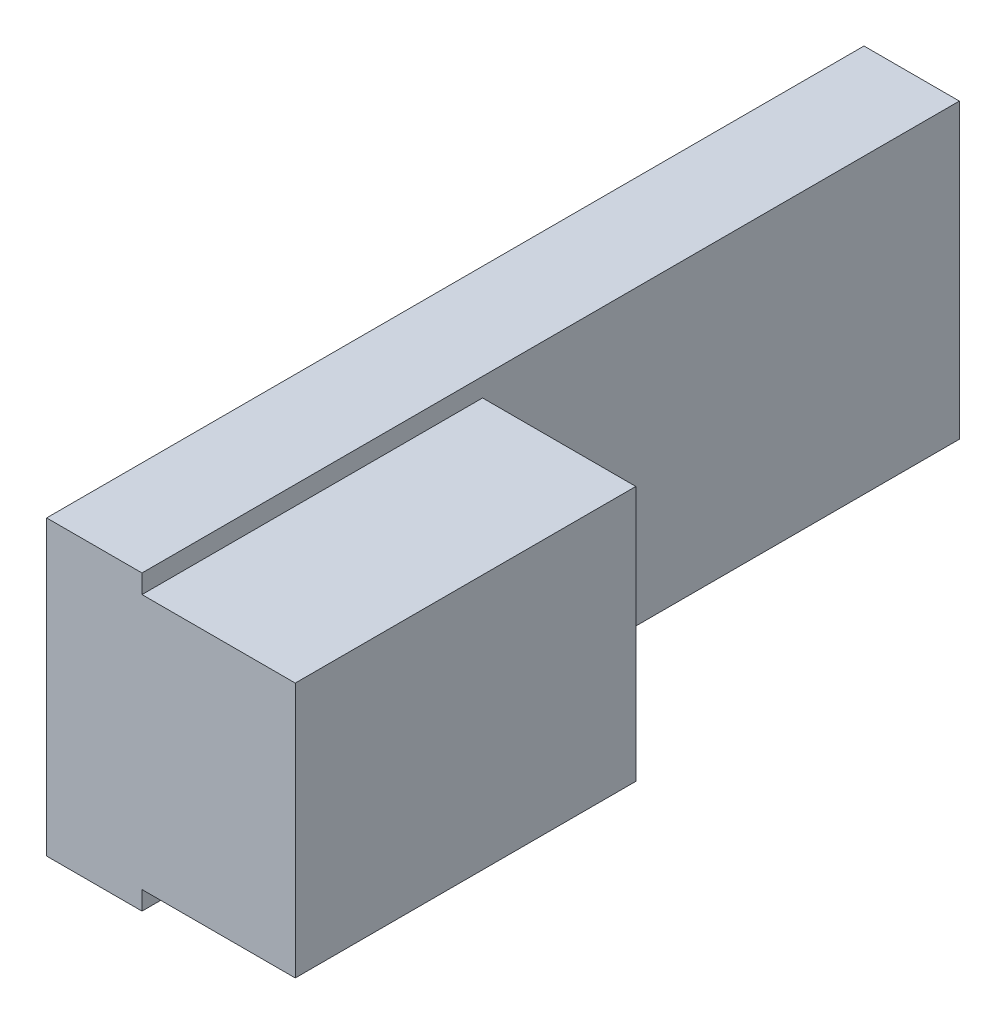
ISO-10303-21;
HEADER;
FILE_DESCRIPTION(('STEP AP214'),'2;1');
FILE_NAME('part.step','',(''),(''),'','','');
FILE_SCHEMA(('AUTOMOTIVE_DESIGN { 1 0 10303 214 1 1 1 1 }'));
ENDSEC;
DATA;
#1=APPLICATION_CONTEXT('core data for automotive mechanical design processes');
#2=APPLICATION_PROTOCOL_DEFINITION('international standard','automotive_design',2000,#1);
#3=PRODUCT_CONTEXT('',#1,'mechanical');
#4=PRODUCT('Part','Part','',(#3));
#5=PRODUCT_RELATED_PRODUCT_CATEGORY('part','',(#4));
#6=PRODUCT_DEFINITION_FORMATION('','',#4);
#7=PRODUCT_DEFINITION_CONTEXT('part definition',#1,'design');
#8=PRODUCT_DEFINITION('design','',#6,#7);
#9=PRODUCT_DEFINITION_SHAPE('','',#8);
#10=(LENGTH_UNIT() NAMED_UNIT(*) SI_UNIT(.MILLI.,.METRE.));
#11=(NAMED_UNIT(*) PLANE_ANGLE_UNIT() SI_UNIT($,.RADIAN.));
#12=(NAMED_UNIT(*) SI_UNIT($,.STERADIAN.) SOLID_ANGLE_UNIT());
#13=UNCERTAINTY_MEASURE_WITH_UNIT(LENGTH_MEASURE(1.E-05),#10,'distance_accuracy_value','');
#14=(GEOMETRIC_REPRESENTATION_CONTEXT(3) GLOBAL_UNCERTAINTY_ASSIGNED_CONTEXT((#13)) GLOBAL_UNIT_ASSIGNED_CONTEXT((#10,
#11,#12)) REPRESENTATION_CONTEXT('',''));
#15=CARTESIAN_POINT('',(0.,0.,0.));
#16=DIRECTION('',(0.,0.,1.));
#17=DIRECTION('',(1.,0.,0.));
#18=AXIS2_PLACEMENT_3D('',#15,#16,#17);
#19=CARTESIAN_POINT('',(5.6,0.,0.));
#20=DIRECTION('',(-1.,0.,0.));
#21=DIRECTION('',(0.,0.,1.));
#22=AXIS2_PLACEMENT_3D('',#19,#20,#21);
#23=PLANE('',#22);
#24=DIRECTION('',(0.,0.,1.));
#25=VECTOR('',#24,1.);
#26=CARTESIAN_POINT('',(5.6,7.5,24.));
#27=LINE('',#26,#25);
#28=CARTESIAN_POINT('',(5.6,7.5,4.));
#29=VERTEX_POINT('',#28);
#30=CARTESIAN_POINT('',(5.6,7.49999999999999,24.));
#31=VERTEX_POINT('',#30);
#32=EDGE_CURVE('E56',#29,#31,#27,.T.);
#33=ORIENTED_EDGE('',*,*,#32,.F.);
#34=DIRECTION('',(0.,1.,0.));
#35=VECTOR('',#34,1.);
#36=CARTESIAN_POINT('',(5.6,7.5,4.));
#37=LINE('',#36,#35);
#38=CARTESIAN_POINT('',(5.6,-7.5,4.));
#39=VERTEX_POINT('',#38);
#40=EDGE_CURVE('E124',#39,#29,#37,.T.);
#41=ORIENTED_EDGE('',*,*,#40,.F.);
#42=DIRECTION('',(0.,0.,-1.));
#43=VECTOR('',#42,1.);
#44=CARTESIAN_POINT('',(5.6,-7.5,4.));
#45=LINE('',#44,#43);
#46=CARTESIAN_POINT('',(5.6,-7.5,24.));
#47=VERTEX_POINT('',#46);
#48=EDGE_CURVE('E277',#47,#39,#45,.T.);
#49=ORIENTED_EDGE('',*,*,#48,.F.);
#50=DIRECTION('',(0.,1.,0.));
#51=VECTOR('',#50,1.);
#52=CARTESIAN_POINT('',(5.6,-8.6,24.));
#53=LINE('',#52,#51);
#54=CARTESIAN_POINT('',(5.6,-8.6,24.));
#55=VERTEX_POINT('',#54);
#56=EDGE_CURVE('E146',#55,#47,#53,.T.);
#57=ORIENTED_EDGE('',*,*,#56,.F.);
#58=DIRECTION('',(0.,0.,1.));
#59=VECTOR('',#58,1.);
#60=CARTESIAN_POINT('',(5.6,-8.6,-24.));
#61=LINE('',#60,#59);
#62=CARTESIAN_POINT('',(5.6,-8.6,-24.));
#63=VERTEX_POINT('',#62);
#64=EDGE_CURVE('E143',#63,#55,#61,.T.);
#65=ORIENTED_EDGE('',*,*,#64,.F.);
#66=DIRECTION('',(0.,-1.,0.));
#67=VECTOR('',#66,1.);
#68=CARTESIAN_POINT('',(5.6,8.6,-24.));
#69=LINE('',#68,#67);
#70=CARTESIAN_POINT('',(5.6,8.6,-24.));
#71=VERTEX_POINT('',#70);
#72=EDGE_CURVE('E139',#71,#63,#69,.T.);
#73=ORIENTED_EDGE('',*,*,#72,.F.);
#74=DIRECTION('',(0.,0.,-1.));
#75=VECTOR('',#74,1.);
#76=CARTESIAN_POINT('',(5.6,8.6,24.));
#77=LINE('',#76,#75);
#78=CARTESIAN_POINT('',(5.6,8.6,24.));
#79=VERTEX_POINT('',#78);
#80=EDGE_CURVE('E136',#79,#71,#77,.T.);
#81=ORIENTED_EDGE('',*,*,#80,.F.);
#82=EDGE_CURVE('E61',#31,#79,#53,.T.);
#83=ORIENTED_EDGE('',*,*,#82,.F.);
#84=EDGE_LOOP('',(#33,#41,#49,#57,#65,#73,#81,#83));
#85=FACE_BOUND('',#84,.T.);
#86=ADVANCED_FACE('F39',(#85),#23,.F.);
#87=CARTESIAN_POINT('',(5.6,8.6,24.));
#88=DIRECTION('',(0.,1.,0.));
#89=DIRECTION('',(0.,0.,1.));
#90=AXIS2_PLACEMENT_3D('',#87,#88,#89);
#91=PLANE('',#90);
#92=DIRECTION('',(0.,0.,-1.));
#93=VECTOR('',#92,1.);
#94=CARTESIAN_POINT('',(0.,8.6,24.));
#95=LINE('',#94,#93);
#96=CARTESIAN_POINT('',(0.,8.6,24.));
#97=VERTEX_POINT('',#96);
#98=CARTESIAN_POINT('',(0.,8.6,-24.));
#99=VERTEX_POINT('',#98);
#100=EDGE_CURVE('E127',#97,#99,#95,.T.);
#101=ORIENTED_EDGE('',*,*,#100,.F.);
#102=DIRECTION('',(-1.,0.,0.));
#103=VECTOR('',#102,1.);
#104=CARTESIAN_POINT('',(5.6,8.6,24.));
#105=LINE('',#104,#103);
#106=EDGE_CURVE('E11',#79,#97,#105,.T.);
#107=ORIENTED_EDGE('',*,*,#106,.F.);
#108=ORIENTED_EDGE('',*,*,#80,.T.);
#109=DIRECTION('',(-1.,0.,0.));
#110=VECTOR('',#109,1.);
#111=CARTESIAN_POINT('',(5.6,8.6,-24.));
#112=LINE('',#111,#110);
#113=EDGE_CURVE('E43',#71,#99,#112,.T.);
#114=ORIENTED_EDGE('',*,*,#113,.T.);
#115=EDGE_LOOP('',(#101,#107,#108,#114));
#116=FACE_BOUND('',#115,.T.);
#117=ADVANCED_FACE('F41',(#116),#91,.T.);
#118=CARTESIAN_POINT('',(5.6,-8.6,24.));
#119=DIRECTION('',(0.,0.,1.));
#120=DIRECTION('',(1.,0.,0.));
#121=AXIS2_PLACEMENT_3D('',#118,#119,#120);
#122=PLANE('',#121);
#123=DIRECTION('',(0.,1.,0.));
#124=VECTOR('',#123,1.);
#125=CARTESIAN_POINT('',(0.,-8.6,24.));
#126=LINE('',#125,#124);
#127=CARTESIAN_POINT('',(0.,-8.6,24.));
#128=VERTEX_POINT('',#127);
#129=EDGE_CURVE('E140',#128,#97,#126,.T.);
#130=ORIENTED_EDGE('',*,*,#129,.F.);
#131=DIRECTION('',(-1.,0.,0.));
#132=VECTOR('',#131,1.);
#133=CARTESIAN_POINT('',(5.6,-8.6,24.));
#134=LINE('',#133,#132);
#135=EDGE_CURVE('E48',#55,#128,#134,.T.);
#136=ORIENTED_EDGE('',*,*,#135,.F.);
#137=ORIENTED_EDGE('',*,*,#56,.T.);
#138=DIRECTION('',(-1.,0.,0.));
#139=VECTOR('',#138,1.);
#140=CARTESIAN_POINT('',(14.6,-7.5,24.));
#141=LINE('',#140,#139);
#142=CARTESIAN_POINT('',(14.6,-7.5,24.));
#143=VERTEX_POINT('',#142);
#144=EDGE_CURVE('E111',#143,#47,#141,.T.);
#145=ORIENTED_EDGE('',*,*,#144,.F.);
#146=DIRECTION('',(0.,-1.,0.));
#147=VECTOR('',#146,1.);
#148=CARTESIAN_POINT('',(14.6,-7.5,24.));
#149=LINE('',#148,#147);
#150=CARTESIAN_POINT('',(14.6,7.5,24.));
#151=VERTEX_POINT('',#150);
#152=EDGE_CURVE('E103',#151,#143,#149,.T.);
#153=ORIENTED_EDGE('',*,*,#152,.F.);
#154=DIRECTION('',(-1.,0.,0.));
#155=VECTOR('',#154,1.);
#156=CARTESIAN_POINT('',(14.6,7.5,24.));
#157=LINE('',#156,#155);
#158=EDGE_CURVE('E108',#151,#31,#157,.T.);
#159=ORIENTED_EDGE('',*,*,#158,.T.);
#160=ORIENTED_EDGE('',*,*,#82,.T.);
#161=ORIENTED_EDGE('',*,*,#106,.T.);
#162=EDGE_LOOP('',(#130,#136,#137,#145,#153,#159,#160,#161));
#163=FACE_BOUND('',#162,.T.);
#164=ADVANCED_FACE('F106',(#163),#122,.T.);
#165=CARTESIAN_POINT('',(5.6,-8.6,-24.));
#166=DIRECTION('',(0.,-1.,0.));
#167=DIRECTION('',(0.,0.,-1.));
#168=AXIS2_PLACEMENT_3D('',#165,#166,#167);
#169=PLANE('',#168);
#170=DIRECTION('',(0.,0.,1.));
#171=VECTOR('',#170,1.);
#172=CARTESIAN_POINT('',(0.,-8.6,-24.));
#173=LINE('',#172,#171);
#174=CARTESIAN_POINT('',(0.,-8.6,-24.));
#175=VERTEX_POINT('',#174);
#176=EDGE_CURVE('E150',#175,#128,#173,.T.);
#177=ORIENTED_EDGE('',*,*,#176,.F.);
#178=DIRECTION('',(-1.,0.,0.));
#179=VECTOR('',#178,1.);
#180=CARTESIAN_POINT('',(5.6,-8.6,-24.));
#181=LINE('',#180,#179);
#182=EDGE_CURVE('E155',#63,#175,#181,.T.);
#183=ORIENTED_EDGE('',*,*,#182,.F.);
#184=ORIENTED_EDGE('',*,*,#64,.T.);
#185=ORIENTED_EDGE('',*,*,#135,.T.);
#186=EDGE_LOOP('',(#177,#183,#184,#185));
#187=FACE_BOUND('',#186,.T.);
#188=ADVANCED_FACE('F169',(#187),#169,.T.);
#189=CARTESIAN_POINT('',(5.6,8.6,-24.));
#190=DIRECTION('',(0.,0.,-1.));
#191=DIRECTION('',(-1.,0.,0.));
#192=AXIS2_PLACEMENT_3D('',#189,#190,#191);
#193=PLANE('',#192);
#194=DIRECTION('',(0.,-1.,0.));
#195=VECTOR('',#194,1.);
#196=CARTESIAN_POINT('',(0.,8.6,-24.));
#197=LINE('',#196,#195);
#198=EDGE_CURVE('E130',#99,#175,#197,.T.);
#199=ORIENTED_EDGE('',*,*,#198,.F.);
#200=ORIENTED_EDGE('',*,*,#113,.F.);
#201=ORIENTED_EDGE('',*,*,#72,.T.);
#202=ORIENTED_EDGE('',*,*,#182,.T.);
#203=EDGE_LOOP('',(#199,#200,#201,#202));
#204=FACE_BOUND('',#203,.T.);
#205=ADVANCED_FACE('F163',(#204),#193,.T.);
#206=CARTESIAN_POINT('',(0.,0.,0.));
#207=DIRECTION('',(-1.,0.,0.));
#208=DIRECTION('',(0.,0.,1.));
#209=AXIS2_PLACEMENT_3D('',#206,#207,#208);
#210=PLANE('',#209);
#211=ORIENTED_EDGE('',*,*,#100,.T.);
#212=ORIENTED_EDGE('',*,*,#198,.T.);
#213=ORIENTED_EDGE('',*,*,#176,.T.);
#214=ORIENTED_EDGE('',*,*,#129,.T.);
#215=EDGE_LOOP('',(#211,#212,#213,#214));
#216=FACE_BOUND('',#215,.T.);
#217=ADVANCED_FACE('F165',(#216),#210,.T.);
#218=CARTESIAN_POINT('',(14.6,7.5,24.));
#219=DIRECTION('',(0.,-1.,0.));
#220=DIRECTION('',(0.,0.,-1.));
#221=AXIS2_PLACEMENT_3D('',#218,#219,#220);
#222=PLANE('',#221);
#223=ORIENTED_EDGE('',*,*,#32,.T.);
#224=ORIENTED_EDGE('',*,*,#158,.F.);
#225=DIRECTION('',(0.,0.,1.));
#226=VECTOR('',#225,1.);
#227=CARTESIAN_POINT('',(14.6,7.5,24.));
#228=LINE('',#227,#226);
#229=CARTESIAN_POINT('',(14.6,7.5,4.));
#230=VERTEX_POINT('',#229);
#231=EDGE_CURVE('E115',#230,#151,#228,.T.);
#232=ORIENTED_EDGE('',*,*,#231,.F.);
#233=DIRECTION('',(-1.,0.,0.));
#234=VECTOR('',#233,1.);
#235=CARTESIAN_POINT('',(14.6,7.5,4.));
#236=LINE('',#235,#234);
#237=EDGE_CURVE('E280',#230,#29,#236,.T.);
#238=ORIENTED_EDGE('',*,*,#237,.T.);
#239=EDGE_LOOP('',(#223,#224,#232,#238));
#240=FACE_BOUND('',#239,.T.);
#241=ADVANCED_FACE('F126',(#240),#222,.F.);
#242=CARTESIAN_POINT('',(14.6,-7.5,4.));
#243=DIRECTION('',(0.,1.,0.));
#244=DIRECTION('',(0.,0.,1.));
#245=AXIS2_PLACEMENT_3D('',#242,#243,#244);
#246=PLANE('',#245);
#247=ORIENTED_EDGE('',*,*,#48,.T.);
#248=DIRECTION('',(-1.,0.,0.));
#249=VECTOR('',#248,1.);
#250=CARTESIAN_POINT('',(14.6,-7.5,4.));
#251=LINE('',#250,#249);
#252=CARTESIAN_POINT('',(14.6,-7.5,4.));
#253=VERTEX_POINT('',#252);
#254=EDGE_CURVE('E132',#253,#39,#251,.T.);
#255=ORIENTED_EDGE('',*,*,#254,.F.);
#256=DIRECTION('',(0.,0.,-1.));
#257=VECTOR('',#256,1.);
#258=CARTESIAN_POINT('',(14.6,-7.5,4.));
#259=LINE('',#258,#257);
#260=EDGE_CURVE('E114',#143,#253,#259,.T.);
#261=ORIENTED_EDGE('',*,*,#260,.F.);
#262=ORIENTED_EDGE('',*,*,#144,.T.);
#263=EDGE_LOOP('',(#247,#255,#261,#262));
#264=FACE_BOUND('',#263,.T.);
#265=ADVANCED_FACE('F189',(#264),#246,.F.);
#266=CARTESIAN_POINT('',(14.6,7.5,4.));
#267=DIRECTION('',(0.,0.,1.));
#268=DIRECTION('',(1.,0.,0.));
#269=AXIS2_PLACEMENT_3D('',#266,#267,#268);
#270=PLANE('',#269);
#271=ORIENTED_EDGE('',*,*,#40,.T.);
#272=ORIENTED_EDGE('',*,*,#237,.F.);
#273=DIRECTION('',(0.,1.,0.));
#274=VECTOR('',#273,1.);
#275=CARTESIAN_POINT('',(14.6,7.5,4.));
#276=LINE('',#275,#274);
#277=EDGE_CURVE('E120',#253,#230,#276,.T.);
#278=ORIENTED_EDGE('',*,*,#277,.F.);
#279=ORIENTED_EDGE('',*,*,#254,.T.);
#280=EDGE_LOOP('',(#271,#272,#278,#279));
#281=FACE_BOUND('',#280,.T.);
#282=ADVANCED_FACE('F193',(#281),#270,.F.);
#283=CARTESIAN_POINT('',(14.6,0.,0.));
#284=DIRECTION('',(-1.,0.,0.));
#285=DIRECTION('',(0.,0.,1.));
#286=AXIS2_PLACEMENT_3D('',#283,#284,#285);
#287=PLANE('',#286);
#288=ORIENTED_EDGE('',*,*,#231,.T.);
#289=ORIENTED_EDGE('',*,*,#152,.T.);
#290=ORIENTED_EDGE('',*,*,#260,.T.);
#291=ORIENTED_EDGE('',*,*,#277,.T.);
#292=EDGE_LOOP('',(#288,#289,#290,#291));
#293=FACE_BOUND('',#292,.T.);
#294=ADVANCED_FACE('F118',(#293),#287,.F.);
#295=CLOSED_SHELL('',(#86,#117,#164,#188,#205,#217,#241,#265,#282,#294));
#296=MANIFOLD_SOLID_BREP('B2',#295);
#297=ADVANCED_BREP_SHAPE_REPRESENTATION('',(#18,#296),#14);
#298=SHAPE_DEFINITION_REPRESENTATION(#9,#297);
ENDSEC;
END-ISO-10303-21;
